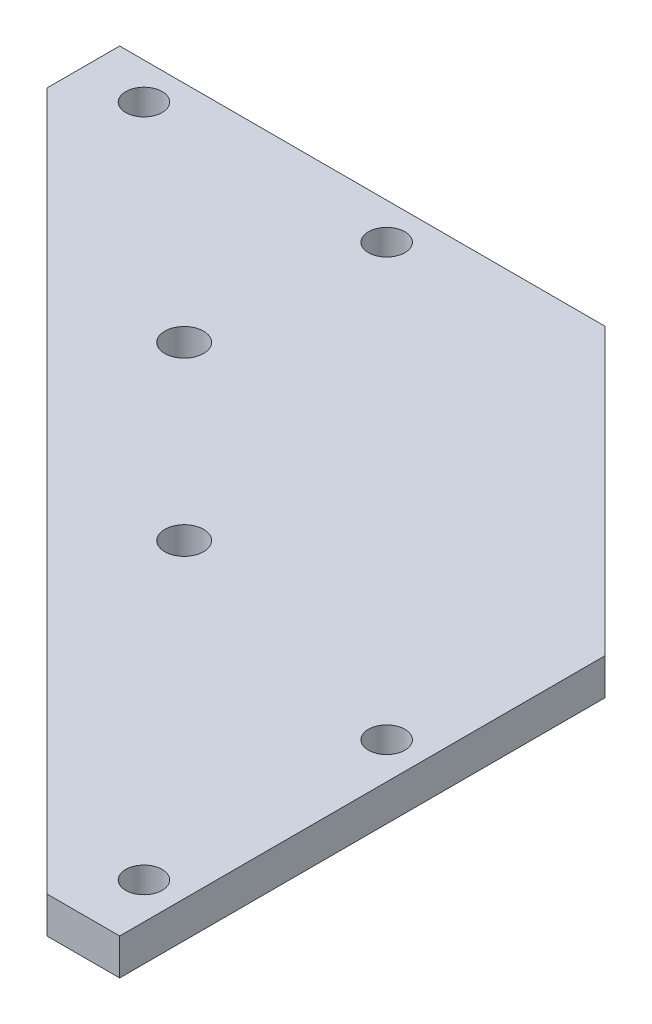
ISO-10303-21;
HEADER;
FILE_DESCRIPTION(('STEP AP214'),'2;1');
FILE_NAME('part.step','',(''),(''),'','','');
FILE_SCHEMA(('AUTOMOTIVE_DESIGN { 1 0 10303 214 1 1 1 1 }'));
ENDSEC;
DATA;
#1=APPLICATION_CONTEXT('core data for automotive mechanical design processes');
#2=APPLICATION_PROTOCOL_DEFINITION('international standard','automotive_design',2000,#1);
#3=PRODUCT_CONTEXT('',#1,'mechanical');
#4=PRODUCT('Part','Part','',(#3));
#5=PRODUCT_RELATED_PRODUCT_CATEGORY('part','',(#4));
#6=PRODUCT_DEFINITION_FORMATION('','',#4);
#7=PRODUCT_DEFINITION_CONTEXT('part definition',#1,'design');
#8=PRODUCT_DEFINITION('design','',#6,#7);
#9=PRODUCT_DEFINITION_SHAPE('','',#8);
#10=(LENGTH_UNIT() NAMED_UNIT(*) SI_UNIT(.MILLI.,.METRE.));
#11=(NAMED_UNIT(*) PLANE_ANGLE_UNIT() SI_UNIT($,.RADIAN.));
#12=(NAMED_UNIT(*) SI_UNIT($,.STERADIAN.) SOLID_ANGLE_UNIT());
#13=UNCERTAINTY_MEASURE_WITH_UNIT(LENGTH_MEASURE(1.E-05),#10,'distance_accuracy_value','');
#14=(GEOMETRIC_REPRESENTATION_CONTEXT(3) GLOBAL_UNCERTAINTY_ASSIGNED_CONTEXT((#13)) GLOBAL_UNIT_ASSIGNED_CONTEXT((#10,
#11,#12)) REPRESENTATION_CONTEXT('',''));
#15=CARTESIAN_POINT('',(0.,0.,0.));
#16=DIRECTION('',(0.,0.,1.));
#17=DIRECTION('',(1.,0.,0.));
#18=AXIS2_PLACEMENT_3D('',#15,#16,#17);
#19=CARTESIAN_POINT('',(0.,3.,0.));
#20=DIRECTION('',(0.,1.,0.));
#21=DIRECTION('',(0.,0.,1.));
#22=AXIS2_PLACEMENT_3D('',#19,#20,#21);
#23=PLANE('',#22);
#24=CARTESIAN_POINT('',(-16.1997474683058,3.,18.4865440327094));
#25=DIRECTION('',(0.,1.,0.));
#26=DIRECTION('',(0.,0.,1.));
#27=AXIS2_PLACEMENT_3D('',#24,#25,#26);
#28=CIRCLE('',#27,1.6);
#29=CARTESIAN_POINT('',(-16.1997474683058,3.,20.0865440327094));
#30=VERTEX_POINT('',#29);
#31=EDGE_CURVE('E170',#30,#30,#28,.T.);
#32=ORIENTED_EDGE('',*,*,#31,.F.);
#33=EDGE_LOOP('',(#32));
#34=FACE_BOUND('',#33,.T.);
#35=CARTESIAN_POINT('',(-2.05761184457486,3.,32.6286796564403));
#36=DIRECTION('',(0.,1.,0.));
#37=DIRECTION('',(0.,0.,1.));
#38=AXIS2_PLACEMENT_3D('',#35,#36,#37);
#39=CIRCLE('',#38,1.6);
#40=CARTESIAN_POINT('',(-2.05761184457486,3.,34.2286796564403));
#41=VERTEX_POINT('',#40);
#42=EDGE_CURVE('E176',#41,#41,#39,.T.);
#43=ORIENTED_EDGE('',*,*,#42,.F.);
#44=EDGE_LOOP('',(#43));
#45=FACE_BOUND('',#44,.T.);
#46=CARTESIAN_POINT('',(20.5,3.,58.5));
#47=DIRECTION('',(0.,1.,0.));
#48=DIRECTION('',(0.,0.,-1.));
#49=AXIS2_PLACEMENT_3D('',#46,#47,#48);
#50=CIRCLE('',#49,1.5);
#51=CARTESIAN_POINT('',(20.5,3.,57.));
#52=VERTEX_POINT('',#51);
#53=EDGE_CURVE('E191',#52,#52,#50,.T.);
#54=ORIENTED_EDGE('',*,*,#53,.F.);
#55=EDGE_LOOP('',(#54));
#56=FACE_BOUND('',#55,.T.);
#57=CARTESIAN_POINT('',(-35.,3.,3.));
#58=DIRECTION('',(0.,1.,0.));
#59=DIRECTION('',(0.,0.,1.));
#60=AXIS2_PLACEMENT_3D('',#57,#58,#59);
#61=CIRCLE('',#60,1.5);
#62=CARTESIAN_POINT('',(-35.,3.,4.50000000000001));
#63=VERTEX_POINT('',#62);
#64=EDGE_CURVE('E141',#63,#63,#61,.T.);
#65=ORIENTED_EDGE('',*,*,#64,.F.);
#66=EDGE_LOOP('',(#65));
#67=FACE_BOUND('',#66,.T.);
#68=DIRECTION('',(-0.707106781186548,0.,-0.707106781186547));
#69=VECTOR('',#68,1.);
#70=CARTESIAN_POINT('',(23.5,3.,23.5));
#71=LINE('',#70,#69);
#72=CARTESIAN_POINT('',(23.5,3.,23.5));
#73=VERTEX_POINT('',#72);
#74=CARTESIAN_POINT('',(0.,3.,0.));
#75=VERTEX_POINT('',#74);
#76=EDGE_CURVE('E154',#73,#75,#71,.T.);
#77=ORIENTED_EDGE('',*,*,#76,.T.);
#78=DIRECTION('',(-1.,0.,0.));
#79=VECTOR('',#78,1.);
#80=CARTESIAN_POINT('',(0.,3.,0.));
#81=LINE('',#80,#79);
#82=CARTESIAN_POINT('',(-40.,3.,0.));
#83=VERTEX_POINT('',#82);
#84=EDGE_CURVE('E105',#75,#83,#81,.T.);
#85=ORIENTED_EDGE('',*,*,#84,.T.);
#86=DIRECTION('',(0.,0.,1.));
#87=VECTOR('',#86,1.);
#88=CARTESIAN_POINT('',(-40.,3.,0.));
#89=LINE('',#88,#87);
#90=CARTESIAN_POINT('',(-40.,3.,6.00000000000001));
#91=VERTEX_POINT('',#90);
#92=EDGE_CURVE('E113',#83,#91,#89,.T.);
#93=ORIENTED_EDGE('',*,*,#92,.T.);
#94=DIRECTION('',(0.707106781186548,0.,0.707106781186547));
#95=VECTOR('',#94,1.);
#96=CARTESIAN_POINT('',(-40.,3.,6.00000000000001));
#97=LINE('',#96,#95);
#98=CARTESIAN_POINT('',(17.5,3.,63.5));
#99=VERTEX_POINT('',#98);
#100=EDGE_CURVE('E108',#91,#99,#97,.T.);
#101=ORIENTED_EDGE('',*,*,#100,.T.);
#102=DIRECTION('',(1.,0.,0.));
#103=VECTOR('',#102,1.);
#104=CARTESIAN_POINT('',(23.5,3.,63.5));
#105=LINE('',#104,#103);
#106=CARTESIAN_POINT('',(23.5,3.,63.5));
#107=VERTEX_POINT('',#106);
#108=EDGE_CURVE('E114',#99,#107,#105,.T.);
#109=ORIENTED_EDGE('',*,*,#108,.T.);
#110=DIRECTION('',(0.,0.,-1.));
#111=VECTOR('',#110,1.);
#112=CARTESIAN_POINT('',(23.5,3.,23.5));
#113=LINE('',#112,#111);
#114=EDGE_CURVE('E65',#107,#73,#113,.T.);
#115=ORIENTED_EDGE('',*,*,#114,.T.);
#116=EDGE_LOOP('',(#77,#85,#93,#101,#109,#115));
#117=FACE_BOUND('',#116,.T.);
#118=CARTESIAN_POINT('',(-15.,3.,3.));
#119=DIRECTION('',(0.,1.,0.));
#120=DIRECTION('',(0.,0.,1.));
#121=AXIS2_PLACEMENT_3D('',#118,#119,#120);
#122=CIRCLE('',#121,1.5);
#123=CARTESIAN_POINT('',(-15.,3.,4.5));
#124=VERTEX_POINT('',#123);
#125=EDGE_CURVE('E200',#124,#124,#122,.T.);
#126=ORIENTED_EDGE('',*,*,#125,.F.);
#127=EDGE_LOOP('',(#126));
#128=FACE_BOUND('',#127,.T.);
#129=CARTESIAN_POINT('',(20.5,3.,38.5));
#130=DIRECTION('',(0.,1.,0.));
#131=DIRECTION('',(0.,0.,-1.));
#132=AXIS2_PLACEMENT_3D('',#129,#130,#131);
#133=CIRCLE('',#132,1.5);
#134=CARTESIAN_POINT('',(20.5,3.,37.));
#135=VERTEX_POINT('',#134);
#136=EDGE_CURVE('E181',#135,#135,#133,.T.);
#137=ORIENTED_EDGE('',*,*,#136,.F.);
#138=EDGE_LOOP('',(#137));
#139=FACE_BOUND('',#138,.T.);
#140=ADVANCED_FACE('F44',(#34,#45,#56,#67,#117,#128,#139),#23,.T.);
#141=CARTESIAN_POINT('',(0.,0.,0.));
#142=DIRECTION('',(0.,1.,0.));
#143=DIRECTION('',(0.,0.,1.));
#144=AXIS2_PLACEMENT_3D('',#141,#142,#143);
#145=PLANE('',#144);
#146=CARTESIAN_POINT('',(-16.1997474683058,0.,18.4865440327094));
#147=DIRECTION('',(0.,1.,0.));
#148=DIRECTION('',(0.,0.,1.));
#149=AXIS2_PLACEMENT_3D('',#146,#147,#148);
#150=CIRCLE('',#149,1.6);
#151=CARTESIAN_POINT('',(-16.1997474683058,0.,20.0865440327094));
#152=VERTEX_POINT('',#151);
#153=EDGE_CURVE('E47',#152,#152,#150,.T.);
#154=ORIENTED_EDGE('',*,*,#153,.T.);
#155=EDGE_LOOP('',(#154));
#156=FACE_BOUND('',#155,.T.);
#157=CARTESIAN_POINT('',(-2.05761184457486,0.,32.6286796564403));
#158=DIRECTION('',(0.,1.,0.));
#159=DIRECTION('',(0.,0.,1.));
#160=AXIS2_PLACEMENT_3D('',#157,#158,#159);
#161=CIRCLE('',#160,1.6);
#162=CARTESIAN_POINT('',(-2.05761184457486,0.,34.2286796564403));
#163=VERTEX_POINT('',#162);
#164=EDGE_CURVE('E163',#163,#163,#161,.T.);
#165=ORIENTED_EDGE('',*,*,#164,.T.);
#166=EDGE_LOOP('',(#165));
#167=FACE_BOUND('',#166,.T.);
#168=DIRECTION('',(-0.707106781186548,0.,-0.707106781186547));
#169=VECTOR('',#168,1.);
#170=CARTESIAN_POINT('',(23.5,0.,23.5));
#171=LINE('',#170,#169);
#172=CARTESIAN_POINT('',(23.5,0.,23.5));
#173=VERTEX_POINT('',#172);
#174=CARTESIAN_POINT('',(0.,0.,0.));
#175=VERTEX_POINT('',#174);
#176=EDGE_CURVE('E138',#173,#175,#171,.T.);
#177=ORIENTED_EDGE('',*,*,#176,.F.);
#178=DIRECTION('',(0.,0.,-1.));
#179=VECTOR('',#178,1.);
#180=CARTESIAN_POINT('',(23.5,0.,23.5));
#181=LINE('',#180,#179);
#182=CARTESIAN_POINT('',(23.5,0.,63.5));
#183=VERTEX_POINT('',#182);
#184=EDGE_CURVE('E94',#183,#173,#181,.T.);
#185=ORIENTED_EDGE('',*,*,#184,.F.);
#186=DIRECTION('',(1.,0.,0.));
#187=VECTOR('',#186,1.);
#188=CARTESIAN_POINT('',(23.5,0.,63.5));
#189=LINE('',#188,#187);
#190=CARTESIAN_POINT('',(17.5,0.,63.5));
#191=VERTEX_POINT('',#190);
#192=EDGE_CURVE('E86',#191,#183,#189,.T.);
#193=ORIENTED_EDGE('',*,*,#192,.F.);
#194=DIRECTION('',(0.707106781186548,0.,0.707106781186547));
#195=VECTOR('',#194,1.);
#196=CARTESIAN_POINT('',(-40.,0.,6.00000000000001));
#197=LINE('',#196,#195);
#198=CARTESIAN_POINT('',(-40.,0.,6.00000000000001));
#199=VERTEX_POINT('',#198);
#200=EDGE_CURVE('E122',#199,#191,#197,.T.);
#201=ORIENTED_EDGE('',*,*,#200,.F.);
#202=DIRECTION('',(0.,0.,1.));
#203=VECTOR('',#202,1.);
#204=CARTESIAN_POINT('',(-40.,0.,0.));
#205=LINE('',#204,#203);
#206=CARTESIAN_POINT('',(-40.,0.,0.));
#207=VERTEX_POINT('',#206);
#208=EDGE_CURVE('E148',#207,#199,#205,.T.);
#209=ORIENTED_EDGE('',*,*,#208,.F.);
#210=DIRECTION('',(-1.,0.,0.));
#211=VECTOR('',#210,1.);
#212=CARTESIAN_POINT('',(0.,0.,0.));
#213=LINE('',#212,#211);
#214=EDGE_CURVE('E142',#175,#207,#213,.T.);
#215=ORIENTED_EDGE('',*,*,#214,.F.);
#216=EDGE_LOOP('',(#177,#185,#193,#201,#209,#215));
#217=FACE_BOUND('',#216,.T.);
#218=CARTESIAN_POINT('',(-35.,0.,3.));
#219=DIRECTION('',(0.,1.,0.));
#220=DIRECTION('',(0.,0.,1.));
#221=AXIS2_PLACEMENT_3D('',#218,#219,#220);
#222=CIRCLE('',#221,1.5);
#223=CARTESIAN_POINT('',(-35.,0.,4.50000000000001));
#224=VERTEX_POINT('',#223);
#225=EDGE_CURVE('E201',#224,#224,#222,.T.);
#226=ORIENTED_EDGE('',*,*,#225,.T.);
#227=EDGE_LOOP('',(#226));
#228=FACE_BOUND('',#227,.T.);
#229=CARTESIAN_POINT('',(-15.,0.,3.));
#230=DIRECTION('',(0.,1.,0.));
#231=DIRECTION('',(0.,0.,1.));
#232=AXIS2_PLACEMENT_3D('',#229,#230,#231);
#233=CIRCLE('',#232,1.5);
#234=CARTESIAN_POINT('',(-15.,0.,4.5));
#235=VERTEX_POINT('',#234);
#236=EDGE_CURVE('E194',#235,#235,#233,.T.);
#237=ORIENTED_EDGE('',*,*,#236,.T.);
#238=EDGE_LOOP('',(#237));
#239=FACE_BOUND('',#238,.T.);
#240=CARTESIAN_POINT('',(20.5,0.,58.5));
#241=DIRECTION('',(0.,1.,0.));
#242=DIRECTION('',(0.,0.,-1.));
#243=AXIS2_PLACEMENT_3D('',#240,#241,#242);
#244=CIRCLE('',#243,1.5);
#245=CARTESIAN_POINT('',(20.5,0.,57.));
#246=VERTEX_POINT('',#245);
#247=EDGE_CURVE('E187',#246,#246,#244,.T.);
#248=ORIENTED_EDGE('',*,*,#247,.T.);
#249=EDGE_LOOP('',(#248));
#250=FACE_BOUND('',#249,.T.);
#251=CARTESIAN_POINT('',(20.5,0.,38.5));
#252=DIRECTION('',(0.,1.,0.));
#253=DIRECTION('',(0.,0.,-1.));
#254=AXIS2_PLACEMENT_3D('',#251,#252,#253);
#255=CIRCLE('',#254,1.5);
#256=CARTESIAN_POINT('',(20.5,0.,37.));
#257=VERTEX_POINT('',#256);
#258=EDGE_CURVE('E174',#257,#257,#255,.T.);
#259=ORIENTED_EDGE('',*,*,#258,.T.);
#260=EDGE_LOOP('',(#259));
#261=FACE_BOUND('',#260,.T.);
#262=ADVANCED_FACE('F221',(#156,#167,#217,#228,#239,#250,#261),#145,.F.);
#263=CARTESIAN_POINT('',(23.5,3.,23.5));
#264=DIRECTION('',(-0.707106781186547,0.,0.707106781186548));
#265=DIRECTION('',(0.707106781186548,0.,0.707106781186547));
#266=AXIS2_PLACEMENT_3D('',#263,#264,#265);
#267=PLANE('',#266);
#268=ORIENTED_EDGE('',*,*,#176,.T.);
#269=DIRECTION('',(0.,-1.,0.));
#270=VECTOR('',#269,1.);
#271=CARTESIAN_POINT('',(0.,3.,0.));
#272=LINE('',#271,#270);
#273=EDGE_CURVE('E11',#75,#175,#272,.T.);
#274=ORIENTED_EDGE('',*,*,#273,.F.);
#275=ORIENTED_EDGE('',*,*,#76,.F.);
#276=DIRECTION('',(0.,-1.,0.));
#277=VECTOR('',#276,1.);
#278=CARTESIAN_POINT('',(23.5,3.,23.5));
#279=LINE('',#278,#277);
#280=EDGE_CURVE('E133',#73,#173,#279,.T.);
#281=ORIENTED_EDGE('',*,*,#280,.T.);
#282=EDGE_LOOP('',(#268,#274,#275,#281));
#283=FACE_BOUND('',#282,.T.);
#284=ADVANCED_FACE('F50',(#283),#267,.F.);
#285=CARTESIAN_POINT('',(0.,3.,0.));
#286=DIRECTION('',(0.,0.,1.));
#287=DIRECTION('',(1.,0.,0.));
#288=AXIS2_PLACEMENT_3D('',#285,#286,#287);
#289=PLANE('',#288);
#290=ORIENTED_EDGE('',*,*,#214,.T.);
#291=DIRECTION('',(0.,-1.,0.));
#292=VECTOR('',#291,1.);
#293=CARTESIAN_POINT('',(-40.,3.,0.));
#294=LINE('',#293,#292);
#295=EDGE_CURVE('E57',#83,#207,#294,.T.);
#296=ORIENTED_EDGE('',*,*,#295,.F.);
#297=ORIENTED_EDGE('',*,*,#84,.F.);
#298=ORIENTED_EDGE('',*,*,#273,.T.);
#299=EDGE_LOOP('',(#290,#296,#297,#298));
#300=FACE_BOUND('',#299,.T.);
#301=ADVANCED_FACE('F217',(#300),#289,.F.);
#302=CARTESIAN_POINT('',(-40.,3.,0.));
#303=DIRECTION('',(1.,0.,0.));
#304=DIRECTION('',(0.,0.,-1.));
#305=AXIS2_PLACEMENT_3D('',#302,#303,#304);
#306=PLANE('',#305);
#307=ORIENTED_EDGE('',*,*,#208,.T.);
#308=DIRECTION('',(0.,-1.,0.));
#309=VECTOR('',#308,1.);
#310=CARTESIAN_POINT('',(-40.,3.,6.00000000000001));
#311=LINE('',#310,#309);
#312=EDGE_CURVE('E127',#91,#199,#311,.T.);
#313=ORIENTED_EDGE('',*,*,#312,.F.);
#314=ORIENTED_EDGE('',*,*,#92,.F.);
#315=ORIENTED_EDGE('',*,*,#295,.T.);
#316=EDGE_LOOP('',(#307,#313,#314,#315));
#317=FACE_BOUND('',#316,.T.);
#318=ADVANCED_FACE('F222',(#317),#306,.F.);
#319=CARTESIAN_POINT('',(-40.,3.,6.00000000000001));
#320=DIRECTION('',(0.707106781186547,0.,-0.707106781186548));
#321=DIRECTION('',(-0.707106781186548,0.,-0.707106781186547));
#322=AXIS2_PLACEMENT_3D('',#319,#320,#321);
#323=PLANE('',#322);
#324=ORIENTED_EDGE('',*,*,#200,.T.);
#325=DIRECTION('',(0.,-1.,0.));
#326=VECTOR('',#325,1.);
#327=CARTESIAN_POINT('',(17.5,3.,63.5));
#328=LINE('',#327,#326);
#329=EDGE_CURVE('E121',#99,#191,#328,.T.);
#330=ORIENTED_EDGE('',*,*,#329,.F.);
#331=ORIENTED_EDGE('',*,*,#100,.F.);
#332=ORIENTED_EDGE('',*,*,#312,.T.);
#333=EDGE_LOOP('',(#324,#330,#331,#332));
#334=FACE_BOUND('',#333,.T.);
#335=ADVANCED_FACE('F125',(#334),#323,.F.);
#336=CARTESIAN_POINT('',(23.5,3.,63.5));
#337=DIRECTION('',(0.,0.,-1.));
#338=DIRECTION('',(-1.,0.,0.));
#339=AXIS2_PLACEMENT_3D('',#336,#337,#338);
#340=PLANE('',#339);
#341=ORIENTED_EDGE('',*,*,#192,.T.);
#342=DIRECTION('',(0.,-1.,0.));
#343=VECTOR('',#342,1.);
#344=CARTESIAN_POINT('',(23.5,3.,63.5));
#345=LINE('',#344,#343);
#346=EDGE_CURVE('E130',#107,#183,#345,.T.);
#347=ORIENTED_EDGE('',*,*,#346,.F.);
#348=ORIENTED_EDGE('',*,*,#108,.F.);
#349=ORIENTED_EDGE('',*,*,#329,.T.);
#350=EDGE_LOOP('',(#341,#347,#348,#349));
#351=FACE_BOUND('',#350,.T.);
#352=ADVANCED_FACE('F129',(#351),#340,.F.);
#353=CARTESIAN_POINT('',(23.5,3.,23.5));
#354=DIRECTION('',(-1.,0.,0.));
#355=DIRECTION('',(0.,0.,1.));
#356=AXIS2_PLACEMENT_3D('',#353,#354,#355);
#357=PLANE('',#356);
#358=ORIENTED_EDGE('',*,*,#184,.T.);
#359=ORIENTED_EDGE('',*,*,#280,.F.);
#360=ORIENTED_EDGE('',*,*,#114,.F.);
#361=ORIENTED_EDGE('',*,*,#346,.T.);
#362=EDGE_LOOP('',(#358,#359,#360,#361));
#363=FACE_BOUND('',#362,.T.);
#364=ADVANCED_FACE('F227',(#363),#357,.F.);
#365=CARTESIAN_POINT('',(-35.,3.,3.));
#366=DIRECTION('',(0.,-1.,0.));
#367=DIRECTION('',(0.,0.,-1.));
#368=AXIS2_PLACEMENT_3D('',#365,#366,#367);
#369=CYLINDRICAL_SURFACE('',#368,1.5);
#370=ORIENTED_EDGE('',*,*,#64,.T.);
#371=EDGE_LOOP('',(#370));
#372=FACE_BOUND('',#371,.T.);
#373=ORIENTED_EDGE('',*,*,#225,.F.);
#374=EDGE_LOOP('',(#373));
#375=FACE_BOUND('',#374,.T.);
#376=ADVANCED_FACE('F228',(#372,#375),#369,.F.);
#377=CARTESIAN_POINT('',(-15.,3.,3.));
#378=DIRECTION('',(0.,-1.,0.));
#379=DIRECTION('',(0.,0.,-1.));
#380=AXIS2_PLACEMENT_3D('',#377,#378,#379);
#381=CYLINDRICAL_SURFACE('',#380,1.5);
#382=ORIENTED_EDGE('',*,*,#125,.T.);
#383=EDGE_LOOP('',(#382));
#384=FACE_BOUND('',#383,.T.);
#385=ORIENTED_EDGE('',*,*,#236,.F.);
#386=EDGE_LOOP('',(#385));
#387=FACE_BOUND('',#386,.T.);
#388=ADVANCED_FACE('F232',(#384,#387),#381,.F.);
#389=CARTESIAN_POINT('',(20.5,3.,58.5));
#390=DIRECTION('',(0.,-1.,0.));
#391=DIRECTION('',(0.,0.,-1.));
#392=AXIS2_PLACEMENT_3D('',#389,#390,#391);
#393=CYLINDRICAL_SURFACE('',#392,1.5);
#394=ORIENTED_EDGE('',*,*,#53,.T.);
#395=EDGE_LOOP('',(#394));
#396=FACE_BOUND('',#395,.T.);
#397=ORIENTED_EDGE('',*,*,#247,.F.);
#398=EDGE_LOOP('',(#397));
#399=FACE_BOUND('',#398,.T.);
#400=ADVANCED_FACE('F247',(#396,#399),#393,.F.);
#401=CARTESIAN_POINT('',(20.5,3.,38.5));
#402=DIRECTION('',(0.,-1.,0.));
#403=DIRECTION('',(0.,0.,-1.));
#404=AXIS2_PLACEMENT_3D('',#401,#402,#403);
#405=CYLINDRICAL_SURFACE('',#404,1.5);
#406=ORIENTED_EDGE('',*,*,#136,.T.);
#407=EDGE_LOOP('',(#406));
#408=FACE_BOUND('',#407,.T.);
#409=ORIENTED_EDGE('',*,*,#258,.F.);
#410=EDGE_LOOP('',(#409));
#411=FACE_BOUND('',#410,.T.);
#412=ADVANCED_FACE('F251',(#408,#411),#405,.F.);
#413=CARTESIAN_POINT('',(-2.05761184457486,-7.,32.6286796564403));
#414=DIRECTION('',(0.,1.,0.));
#415=DIRECTION('',(0.,0.,1.));
#416=AXIS2_PLACEMENT_3D('',#413,#414,#415);
#417=CYLINDRICAL_SURFACE('',#416,1.6);
#418=ORIENTED_EDGE('',*,*,#42,.T.);
#419=EDGE_LOOP('',(#418));
#420=FACE_BOUND('',#419,.T.);
#421=ORIENTED_EDGE('',*,*,#164,.F.);
#422=EDGE_LOOP('',(#421));
#423=FACE_BOUND('',#422,.T.);
#424=ADVANCED_FACE('F260',(#420,#423),#417,.F.);
#425=CARTESIAN_POINT('',(-16.1997474683058,-7.,18.4865440327094));
#426=DIRECTION('',(0.,1.,0.));
#427=DIRECTION('',(0.,0.,1.));
#428=AXIS2_PLACEMENT_3D('',#425,#426,#427);
#429=CYLINDRICAL_SURFACE('',#428,1.6);
#430=ORIENTED_EDGE('',*,*,#31,.T.);
#431=EDGE_LOOP('',(#430));
#432=FACE_BOUND('',#431,.T.);
#433=ORIENTED_EDGE('',*,*,#153,.F.);
#434=EDGE_LOOP('',(#433));
#435=FACE_BOUND('',#434,.T.);
#436=ADVANCED_FACE('F261',(#432,#435),#429,.F.);
#437=CLOSED_SHELL('',(#140,#262,#284,#301,#318,#335,#352,#364,#376,#388,#400,#412,#424,#436));
#438=MANIFOLD_SOLID_BREP('B2',#437);
#439=ADVANCED_BREP_SHAPE_REPRESENTATION('',(#18,#438),#14);
#440=SHAPE_DEFINITION_REPRESENTATION(#9,#439);
ENDSEC;
END-ISO-10303-21;
